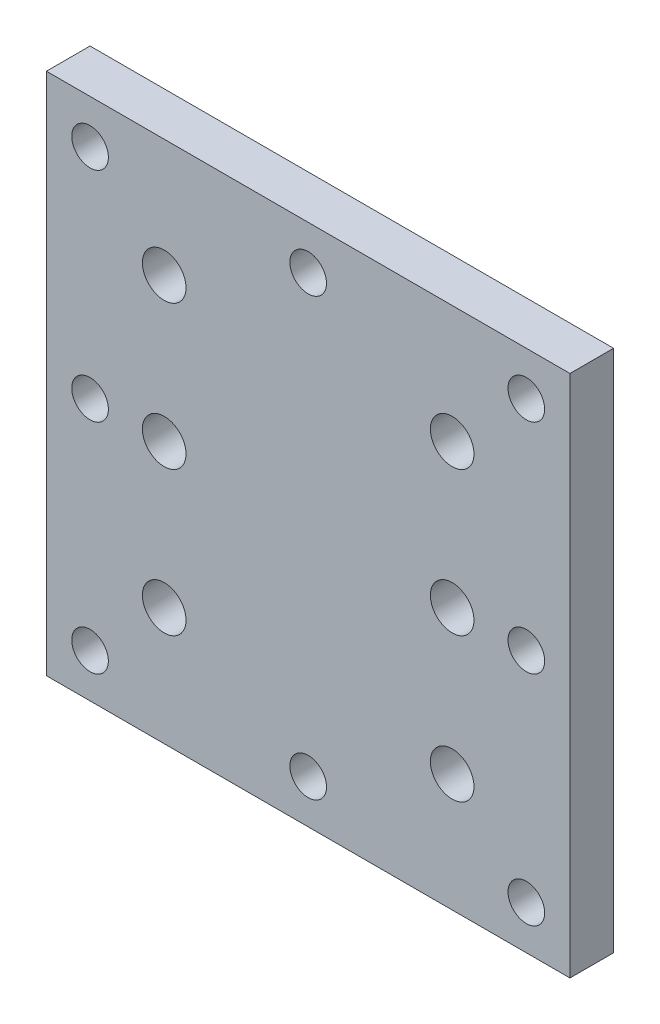
ISO-10303-21;
HEADER;
FILE_DESCRIPTION(('STEP AP214'),'2;1');
FILE_NAME('part.step','',(''),(''),'','','');
FILE_SCHEMA(('AUTOMOTIVE_DESIGN { 1 0 10303 214 1 1 1 1 }'));
ENDSEC;
DATA;
#1=APPLICATION_CONTEXT('core data for automotive mechanical design processes');
#2=APPLICATION_PROTOCOL_DEFINITION('international standard','automotive_design',2000,#1);
#3=PRODUCT_CONTEXT('',#1,'mechanical');
#4=PRODUCT('Part','Part','',(#3));
#5=PRODUCT_RELATED_PRODUCT_CATEGORY('part','',(#4));
#6=PRODUCT_DEFINITION_FORMATION('','',#4);
#7=PRODUCT_DEFINITION_CONTEXT('part definition',#1,'design');
#8=PRODUCT_DEFINITION('design','',#6,#7);
#9=PRODUCT_DEFINITION_SHAPE('','',#8);
#10=(LENGTH_UNIT() NAMED_UNIT(*) SI_UNIT(.MILLI.,.METRE.));
#11=(NAMED_UNIT(*) PLANE_ANGLE_UNIT() SI_UNIT($,.RADIAN.));
#12=(NAMED_UNIT(*) SI_UNIT($,.STERADIAN.) SOLID_ANGLE_UNIT());
#13=UNCERTAINTY_MEASURE_WITH_UNIT(LENGTH_MEASURE(1.E-05),#10,'distance_accuracy_value','');
#14=(GEOMETRIC_REPRESENTATION_CONTEXT(3) GLOBAL_UNCERTAINTY_ASSIGNED_CONTEXT((#13)) GLOBAL_UNIT_ASSIGNED_CONTEXT((#10,
#11,#12)) REPRESENTATION_CONTEXT('',''));
#15=CARTESIAN_POINT('',(0.,0.,0.));
#16=DIRECTION('',(0.,0.,1.));
#17=DIRECTION('',(1.,0.,0.));
#18=AXIS2_PLACEMENT_3D('',#15,#16,#17);
#19=CARTESIAN_POINT('',(16.5,0.,-5.));
#20=DIRECTION('',(0.,0.,1.));
#21=DIRECTION('',(1.,0.,0.));
#22=AXIS2_PLACEMENT_3D('',#19,#20,#21);
#23=CYLINDRICAL_SURFACE('',#22,2.5);
#24=CARTESIAN_POINT('',(16.5,0.,0.));
#25=DIRECTION('',(0.,0.,-1.));
#26=DIRECTION('',(-1.,0.,0.));
#27=AXIS2_PLACEMENT_3D('',#24,#25,#26);
#28=CIRCLE('',#27,2.5);
#29=CARTESIAN_POINT('',(14.,0.,0.));
#30=VERTEX_POINT('',#29);
#31=EDGE_CURVE('E180',#30,#30,#28,.T.);
#32=ORIENTED_EDGE('',*,*,#31,.T.);
#33=EDGE_LOOP('',(#32));
#34=FACE_BOUND('',#33,.T.);
#35=CARTESIAN_POINT('',(16.5,0.,5.));
#36=DIRECTION('',(0.,0.,1.));
#37=DIRECTION('',(-1.,0.,0.));
#38=AXIS2_PLACEMENT_3D('',#35,#36,#37);
#39=CIRCLE('',#38,2.5);
#40=CARTESIAN_POINT('',(14.,0.,5.));
#41=VERTEX_POINT('',#40);
#42=EDGE_CURVE('E104',#41,#41,#39,.T.);
#43=ORIENTED_EDGE('',*,*,#42,.T.);
#44=EDGE_LOOP('',(#43));
#45=FACE_BOUND('',#44,.T.);
#46=ADVANCED_FACE('F17',(#34,#45),#23,.F.);
#47=CARTESIAN_POINT('',(16.5,16.5,-5.));
#48=DIRECTION('',(0.,0.,1.));
#49=DIRECTION('',(1.,0.,0.));
#50=AXIS2_PLACEMENT_3D('',#47,#48,#49);
#51=CYLINDRICAL_SURFACE('',#50,2.5);
#52=CARTESIAN_POINT('',(16.5,16.5,0.));
#53=DIRECTION('',(0.,0.,-1.));
#54=DIRECTION('',(-1.,0.,0.));
#55=AXIS2_PLACEMENT_3D('',#52,#53,#54);
#56=CIRCLE('',#55,2.5);
#57=CARTESIAN_POINT('',(14.,16.5,0.));
#58=VERTEX_POINT('',#57);
#59=EDGE_CURVE('E184',#58,#58,#56,.T.);
#60=ORIENTED_EDGE('',*,*,#59,.T.);
#61=EDGE_LOOP('',(#60));
#62=FACE_BOUND('',#61,.T.);
#63=CARTESIAN_POINT('',(16.5,16.5,5.));
#64=DIRECTION('',(0.,0.,1.));
#65=DIRECTION('',(-1.,0.,0.));
#66=AXIS2_PLACEMENT_3D('',#63,#64,#65);
#67=CIRCLE('',#66,2.5);
#68=CARTESIAN_POINT('',(14.,16.5,5.));
#69=VERTEX_POINT('',#68);
#70=EDGE_CURVE('E131',#69,#69,#67,.T.);
#71=ORIENTED_EDGE('',*,*,#70,.T.);
#72=EDGE_LOOP('',(#71));
#73=FACE_BOUND('',#72,.T.);
#74=ADVANCED_FACE('F266',(#62,#73),#51,.F.);
#75=CARTESIAN_POINT('',(16.5,-16.5,-5.));
#76=DIRECTION('',(0.,0.,1.));
#77=DIRECTION('',(1.,0.,0.));
#78=AXIS2_PLACEMENT_3D('',#75,#76,#77);
#79=CYLINDRICAL_SURFACE('',#78,2.5);
#80=CARTESIAN_POINT('',(16.5,-16.5,0.));
#81=DIRECTION('',(0.,0.,-1.));
#82=DIRECTION('',(-1.,0.,0.));
#83=AXIS2_PLACEMENT_3D('',#80,#81,#82);
#84=CIRCLE('',#83,2.5);
#85=CARTESIAN_POINT('',(14.,-16.5,0.));
#86=VERTEX_POINT('',#85);
#87=EDGE_CURVE('E185',#86,#86,#84,.T.);
#88=ORIENTED_EDGE('',*,*,#87,.T.);
#89=EDGE_LOOP('',(#88));
#90=FACE_BOUND('',#89,.T.);
#91=CARTESIAN_POINT('',(16.5,-16.5,5.));
#92=DIRECTION('',(0.,0.,1.));
#93=DIRECTION('',(1.,0.,0.));
#94=AXIS2_PLACEMENT_3D('',#91,#92,#93);
#95=CIRCLE('',#94,2.5);
#96=CARTESIAN_POINT('',(19.,-16.5,5.));
#97=VERTEX_POINT('',#96);
#98=EDGE_CURVE('E126',#97,#97,#95,.T.);
#99=ORIENTED_EDGE('',*,*,#98,.T.);
#100=EDGE_LOOP('',(#99));
#101=FACE_BOUND('',#100,.T.);
#102=ADVANCED_FACE('F596',(#90,#101),#79,.F.);
#103=CARTESIAN_POINT('',(-16.5,-16.5,-5.));
#104=DIRECTION('',(0.,0.,1.));
#105=DIRECTION('',(1.,0.,0.));
#106=AXIS2_PLACEMENT_3D('',#103,#104,#105);
#107=CYLINDRICAL_SURFACE('',#106,2.5);
#108=CARTESIAN_POINT('',(-16.5,-16.5,0.));
#109=DIRECTION('',(0.,0.,-1.));
#110=DIRECTION('',(-1.,0.,0.));
#111=AXIS2_PLACEMENT_3D('',#108,#109,#110);
#112=CIRCLE('',#111,2.5);
#113=CARTESIAN_POINT('',(-19.,-16.5,0.));
#114=VERTEX_POINT('',#113);
#115=EDGE_CURVE('E189',#114,#114,#112,.T.);
#116=ORIENTED_EDGE('',*,*,#115,.T.);
#117=EDGE_LOOP('',(#116));
#118=FACE_BOUND('',#117,.T.);
#119=CARTESIAN_POINT('',(-16.5,-16.5,5.));
#120=DIRECTION('',(0.,0.,1.));
#121=DIRECTION('',(-1.,0.,0.));
#122=AXIS2_PLACEMENT_3D('',#119,#120,#121);
#123=CIRCLE('',#122,2.5);
#124=CARTESIAN_POINT('',(-19.,-16.5,5.));
#125=VERTEX_POINT('',#124);
#126=EDGE_CURVE('E130',#125,#125,#123,.T.);
#127=ORIENTED_EDGE('',*,*,#126,.T.);
#128=EDGE_LOOP('',(#127));
#129=FACE_BOUND('',#128,.T.);
#130=ADVANCED_FACE('F571',(#118,#129),#107,.F.);
#131=CARTESIAN_POINT('',(-16.5,0.,-5.));
#132=DIRECTION('',(0.,0.,1.));
#133=DIRECTION('',(1.,0.,0.));
#134=AXIS2_PLACEMENT_3D('',#131,#132,#133);
#135=CYLINDRICAL_SURFACE('',#134,2.5);
#136=CARTESIAN_POINT('',(-16.5,0.,0.));
#137=DIRECTION('',(0.,0.,-1.));
#138=DIRECTION('',(-1.,0.,0.));
#139=AXIS2_PLACEMENT_3D('',#136,#137,#138);
#140=CIRCLE('',#139,2.5);
#141=CARTESIAN_POINT('',(-19.,0.,0.));
#142=VERTEX_POINT('',#141);
#143=EDGE_CURVE('E193',#142,#142,#140,.T.);
#144=ORIENTED_EDGE('',*,*,#143,.T.);
#145=EDGE_LOOP('',(#144));
#146=FACE_BOUND('',#145,.T.);
#147=CARTESIAN_POINT('',(-16.5,0.,5.));
#148=DIRECTION('',(0.,0.,1.));
#149=DIRECTION('',(1.,0.,0.));
#150=AXIS2_PLACEMENT_3D('',#147,#148,#149);
#151=CIRCLE('',#150,2.5);
#152=CARTESIAN_POINT('',(-14.,0.,5.));
#153=VERTEX_POINT('',#152);
#154=EDGE_CURVE('E139',#153,#153,#151,.T.);
#155=ORIENTED_EDGE('',*,*,#154,.T.);
#156=EDGE_LOOP('',(#155));
#157=FACE_BOUND('',#156,.T.);
#158=ADVANCED_FACE('F566',(#146,#157),#135,.F.);
#159=CARTESIAN_POINT('',(-16.5,16.5,-5.));
#160=DIRECTION('',(0.,0.,1.));
#161=DIRECTION('',(1.,0.,0.));
#162=AXIS2_PLACEMENT_3D('',#159,#160,#161);
#163=CYLINDRICAL_SURFACE('',#162,2.5);
#164=CARTESIAN_POINT('',(-16.5,16.5,0.));
#165=DIRECTION('',(0.,0.,-1.));
#166=DIRECTION('',(-1.,0.,0.));
#167=AXIS2_PLACEMENT_3D('',#164,#165,#166);
#168=CIRCLE('',#167,2.5);
#169=CARTESIAN_POINT('',(-19.,16.5,0.));
#170=VERTEX_POINT('',#169);
#171=EDGE_CURVE('E197',#170,#170,#168,.T.);
#172=ORIENTED_EDGE('',*,*,#171,.T.);
#173=EDGE_LOOP('',(#172));
#174=FACE_BOUND('',#173,.T.);
#175=CARTESIAN_POINT('',(-16.5,16.5,5.));
#176=DIRECTION('',(0.,0.,1.));
#177=DIRECTION('',(1.,0.,0.));
#178=AXIS2_PLACEMENT_3D('',#175,#176,#177);
#179=CIRCLE('',#178,2.5);
#180=CARTESIAN_POINT('',(-14.,16.5,5.));
#181=VERTEX_POINT('',#180);
#182=EDGE_CURVE('E143',#181,#181,#179,.T.);
#183=ORIENTED_EDGE('',*,*,#182,.T.);
#184=EDGE_LOOP('',(#183));
#185=FACE_BOUND('',#184,.T.);
#186=ADVANCED_FACE('F570',(#174,#185),#163,.F.);
#187=CARTESIAN_POINT('',(-25.,25.,5.));
#188=DIRECTION('',(0.,0.,1.));
#189=DIRECTION('',(1.,0.,0.));
#190=AXIS2_PLACEMENT_3D('',#187,#188,#189);
#191=CYLINDRICAL_SURFACE('',#190,2.1);
#192=CARTESIAN_POINT('',(-25.,25.,0.));
#193=DIRECTION('',(0.,0.,-1.));
#194=DIRECTION('',(-1.,0.,0.));
#195=AXIS2_PLACEMENT_3D('',#192,#193,#194);
#196=CIRCLE('',#195,2.1);
#197=CARTESIAN_POINT('',(-27.1,25.,0.));
#198=VERTEX_POINT('',#197);
#199=EDGE_CURVE('E201',#198,#198,#196,.T.);
#200=ORIENTED_EDGE('',*,*,#199,.T.);
#201=EDGE_LOOP('',(#200));
#202=FACE_BOUND('',#201,.T.);
#203=CARTESIAN_POINT('',(-25.,25.,5.));
#204=DIRECTION('',(0.,0.,1.));
#205=DIRECTION('',(1.,0.,0.));
#206=AXIS2_PLACEMENT_3D('',#203,#204,#205);
#207=CIRCLE('',#206,2.1);
#208=CARTESIAN_POINT('',(-22.9,25.,5.));
#209=VERTEX_POINT('',#208);
#210=EDGE_CURVE('E154',#209,#209,#207,.T.);
#211=ORIENTED_EDGE('',*,*,#210,.T.);
#212=EDGE_LOOP('',(#211));
#213=FACE_BOUND('',#212,.T.);
#214=ADVANCED_FACE('F552',(#202,#213),#191,.F.);
#215=CARTESIAN_POINT('',(0.,25.,5.));
#216=DIRECTION('',(0.,0.,1.));
#217=DIRECTION('',(1.,0.,0.));
#218=AXIS2_PLACEMENT_3D('',#215,#216,#217);
#219=CYLINDRICAL_SURFACE('',#218,2.1);
#220=CARTESIAN_POINT('',(0.,25.,0.));
#221=DIRECTION('',(0.,0.,-1.));
#222=DIRECTION('',(-1.,0.,0.));
#223=AXIS2_PLACEMENT_3D('',#220,#221,#222);
#224=CIRCLE('',#223,2.1);
#225=CARTESIAN_POINT('',(-2.1,25.,0.));
#226=VERTEX_POINT('',#225);
#227=EDGE_CURVE('E202',#226,#226,#224,.T.);
#228=ORIENTED_EDGE('',*,*,#227,.T.);
#229=EDGE_LOOP('',(#228));
#230=FACE_BOUND('',#229,.T.);
#231=CARTESIAN_POINT('',(0.,25.,5.));
#232=DIRECTION('',(0.,0.,1.));
#233=DIRECTION('',(1.,0.,0.));
#234=AXIS2_PLACEMENT_3D('',#231,#232,#233);
#235=CIRCLE('',#234,2.1);
#236=CARTESIAN_POINT('',(2.1,25.,5.));
#237=VERTEX_POINT('',#236);
#238=EDGE_CURVE('E158',#237,#237,#235,.T.);
#239=ORIENTED_EDGE('',*,*,#238,.T.);
#240=EDGE_LOOP('',(#239));
#241=FACE_BOUND('',#240,.T.);
#242=ADVANCED_FACE('F513',(#230,#241),#219,.F.);
#243=CARTESIAN_POINT('',(25.,25.,5.));
#244=DIRECTION('',(0.,0.,1.));
#245=DIRECTION('',(1.,0.,0.));
#246=AXIS2_PLACEMENT_3D('',#243,#244,#245);
#247=CYLINDRICAL_SURFACE('',#246,2.1);
#248=CARTESIAN_POINT('',(25.,25.,0.));
#249=DIRECTION('',(0.,0.,-1.));
#250=DIRECTION('',(-1.,0.,0.));
#251=AXIS2_PLACEMENT_3D('',#248,#249,#250);
#252=CIRCLE('',#251,2.1);
#253=CARTESIAN_POINT('',(22.9,25.,0.));
#254=VERTEX_POINT('',#253);
#255=EDGE_CURVE('E206',#254,#254,#252,.T.);
#256=ORIENTED_EDGE('',*,*,#255,.T.);
#257=EDGE_LOOP('',(#256));
#258=FACE_BOUND('',#257,.T.);
#259=CARTESIAN_POINT('',(25.,25.,5.));
#260=DIRECTION('',(0.,0.,1.));
#261=DIRECTION('',(1.,0.,0.));
#262=AXIS2_PLACEMENT_3D('',#259,#260,#261);
#263=CIRCLE('',#262,2.1);
#264=CARTESIAN_POINT('',(27.1,25.,5.));
#265=VERTEX_POINT('',#264);
#266=EDGE_CURVE('E163',#265,#265,#263,.T.);
#267=ORIENTED_EDGE('',*,*,#266,.T.);
#268=EDGE_LOOP('',(#267));
#269=FACE_BOUND('',#268,.T.);
#270=ADVANCED_FACE('F508',(#258,#269),#247,.F.);
#271=CARTESIAN_POINT('',(25.,-25.,5.));
#272=DIRECTION('',(0.,0.,1.));
#273=DIRECTION('',(1.,0.,0.));
#274=AXIS2_PLACEMENT_3D('',#271,#272,#273);
#275=CYLINDRICAL_SURFACE('',#274,2.1);
#276=CARTESIAN_POINT('',(25.,-25.,0.));
#277=DIRECTION('',(0.,0.,-1.));
#278=DIRECTION('',(-1.,0.,0.));
#279=AXIS2_PLACEMENT_3D('',#276,#277,#278);
#280=CIRCLE('',#279,2.1);
#281=CARTESIAN_POINT('',(22.9,-25.,0.));
#282=VERTEX_POINT('',#281);
#283=EDGE_CURVE('E213',#282,#282,#280,.T.);
#284=ORIENTED_EDGE('',*,*,#283,.T.);
#285=EDGE_LOOP('',(#284));
#286=FACE_BOUND('',#285,.T.);
#287=CARTESIAN_POINT('',(25.,-25.,5.));
#288=DIRECTION('',(0.,0.,1.));
#289=DIRECTION('',(1.,0.,0.));
#290=AXIS2_PLACEMENT_3D('',#287,#288,#289);
#291=CIRCLE('',#290,2.1);
#292=CARTESIAN_POINT('',(27.1,-25.,5.));
#293=VERTEX_POINT('',#292);
#294=EDGE_CURVE('E159',#293,#293,#291,.T.);
#295=ORIENTED_EDGE('',*,*,#294,.T.);
#296=EDGE_LOOP('',(#295));
#297=FACE_BOUND('',#296,.T.);
#298=ADVANCED_FACE('F512',(#286,#297),#275,.F.);
#299=CARTESIAN_POINT('',(0.,-25.,5.));
#300=DIRECTION('',(0.,0.,1.));
#301=DIRECTION('',(1.,0.,0.));
#302=AXIS2_PLACEMENT_3D('',#299,#300,#301);
#303=CYLINDRICAL_SURFACE('',#302,2.1);
#304=CARTESIAN_POINT('',(0.,-25.,0.));
#305=DIRECTION('',(0.,0.,-1.));
#306=DIRECTION('',(-1.,0.,0.));
#307=AXIS2_PLACEMENT_3D('',#304,#305,#306);
#308=CIRCLE('',#307,2.1);
#309=CARTESIAN_POINT('',(-2.09999999999999,-25.,0.));
#310=VERTEX_POINT('',#309);
#311=EDGE_CURVE('E217',#310,#310,#308,.T.);
#312=ORIENTED_EDGE('',*,*,#311,.T.);
#313=EDGE_LOOP('',(#312));
#314=FACE_BOUND('',#313,.T.);
#315=CARTESIAN_POINT('',(0.,-25.,5.));
#316=DIRECTION('',(0.,0.,1.));
#317=DIRECTION('',(1.,0.,0.));
#318=AXIS2_PLACEMENT_3D('',#315,#316,#317);
#319=CIRCLE('',#318,2.1);
#320=CARTESIAN_POINT('',(2.10000000000001,-25.,5.));
#321=VERTEX_POINT('',#320);
#322=EDGE_CURVE('E120',#321,#321,#319,.T.);
#323=ORIENTED_EDGE('',*,*,#322,.T.);
#324=EDGE_LOOP('',(#323));
#325=FACE_BOUND('',#324,.T.);
#326=ADVANCED_FACE('F535',(#314,#325),#303,.F.);
#327=CARTESIAN_POINT('',(-25.,-25.,5.));
#328=DIRECTION('',(0.,0.,1.));
#329=DIRECTION('',(1.,0.,0.));
#330=AXIS2_PLACEMENT_3D('',#327,#328,#329);
#331=CYLINDRICAL_SURFACE('',#330,2.1);
#332=CARTESIAN_POINT('',(-25.,-25.,0.));
#333=DIRECTION('',(0.,0.,-1.));
#334=DIRECTION('',(-1.,0.,0.));
#335=AXIS2_PLACEMENT_3D('',#332,#333,#334);
#336=CIRCLE('',#335,2.1);
#337=CARTESIAN_POINT('',(-27.1,-25.,0.));
#338=VERTEX_POINT('',#337);
#339=EDGE_CURVE('E221',#338,#338,#336,.T.);
#340=ORIENTED_EDGE('',*,*,#339,.T.);
#341=EDGE_LOOP('',(#340));
#342=FACE_BOUND('',#341,.T.);
#343=CARTESIAN_POINT('',(-25.,-25.,5.));
#344=DIRECTION('',(0.,0.,1.));
#345=DIRECTION('',(1.,0.,0.));
#346=AXIS2_PLACEMENT_3D('',#343,#344,#345);
#347=CIRCLE('',#346,2.1);
#348=CARTESIAN_POINT('',(-22.9,-25.,5.));
#349=VERTEX_POINT('',#348);
#350=EDGE_CURVE('E115',#349,#349,#347,.T.);
#351=ORIENTED_EDGE('',*,*,#350,.T.);
#352=EDGE_LOOP('',(#351));
#353=FACE_BOUND('',#352,.T.);
#354=ADVANCED_FACE('F488',(#342,#353),#331,.F.);
#355=CARTESIAN_POINT('',(-25.,0.,5.));
#356=DIRECTION('',(0.,0.,1.));
#357=DIRECTION('',(1.,0.,0.));
#358=AXIS2_PLACEMENT_3D('',#355,#356,#357);
#359=CYLINDRICAL_SURFACE('',#358,2.1);
#360=CARTESIAN_POINT('',(-25.,0.,0.));
#361=DIRECTION('',(0.,0.,-1.));
#362=DIRECTION('',(-1.,0.,0.));
#363=AXIS2_PLACEMENT_3D('',#360,#361,#362);
#364=CIRCLE('',#363,2.1);
#365=CARTESIAN_POINT('',(-27.1,0.,0.));
#366=VERTEX_POINT('',#365);
#367=EDGE_CURVE('E25',#366,#366,#364,.T.);
#368=ORIENTED_EDGE('',*,*,#367,.T.);
#369=EDGE_LOOP('',(#368));
#370=FACE_BOUND('',#369,.T.);
#371=CARTESIAN_POINT('',(-25.,0.,5.));
#372=DIRECTION('',(0.,0.,1.));
#373=DIRECTION('',(1.,0.,0.));
#374=AXIS2_PLACEMENT_3D('',#371,#372,#373);
#375=CIRCLE('',#374,2.1);
#376=CARTESIAN_POINT('',(-22.9,0.,5.));
#377=VERTEX_POINT('',#376);
#378=EDGE_CURVE('E119',#377,#377,#375,.T.);
#379=ORIENTED_EDGE('',*,*,#378,.T.);
#380=EDGE_LOOP('',(#379));
#381=FACE_BOUND('',#380,.T.);
#382=ADVANCED_FACE('F230',(#370,#381),#359,.F.);
#383=CARTESIAN_POINT('',(25.,0.,5.));
#384=DIRECTION('',(0.,0.,1.));
#385=DIRECTION('',(1.,0.,0.));
#386=AXIS2_PLACEMENT_3D('',#383,#384,#385);
#387=CYLINDRICAL_SURFACE('',#386,2.1);
#388=CARTESIAN_POINT('',(25.,0.,0.));
#389=DIRECTION('',(0.,0.,-1.));
#390=DIRECTION('',(-1.,0.,0.));
#391=AXIS2_PLACEMENT_3D('',#388,#389,#390);
#392=CIRCLE('',#391,2.1);
#393=CARTESIAN_POINT('',(22.9,0.,0.));
#394=VERTEX_POINT('',#393);
#395=EDGE_CURVE('E11',#394,#394,#392,.T.);
#396=ORIENTED_EDGE('',*,*,#395,.T.);
#397=EDGE_LOOP('',(#396));
#398=FACE_BOUND('',#397,.T.);
#399=CARTESIAN_POINT('',(25.,0.,5.));
#400=DIRECTION('',(0.,0.,1.));
#401=DIRECTION('',(1.,0.,0.));
#402=AXIS2_PLACEMENT_3D('',#399,#400,#401);
#403=CIRCLE('',#402,2.1);
#404=CARTESIAN_POINT('',(27.1,0.,5.));
#405=VERTEX_POINT('',#404);
#406=EDGE_CURVE('E176',#405,#405,#403,.T.);
#407=ORIENTED_EDGE('',*,*,#406,.T.);
#408=EDGE_LOOP('',(#407));
#409=FACE_BOUND('',#408,.T.);
#410=ADVANCED_FACE('F236',(#398,#409),#387,.F.);
#411=CARTESIAN_POINT('',(0.,0.,0.));
#412=DIRECTION('',(0.,0.,-1.));
#413=DIRECTION('',(0.,-1.,0.));
#414=AXIS2_PLACEMENT_3D('',#411,#412,#413);
#415=PLANE('',#414);
#416=ORIENTED_EDGE('',*,*,#395,.F.);
#417=EDGE_LOOP('',(#416));
#418=FACE_BOUND('',#417,.T.);
#419=ORIENTED_EDGE('',*,*,#367,.F.);
#420=EDGE_LOOP('',(#419));
#421=FACE_BOUND('',#420,.T.);
#422=ORIENTED_EDGE('',*,*,#339,.F.);
#423=EDGE_LOOP('',(#422));
#424=FACE_BOUND('',#423,.T.);
#425=ORIENTED_EDGE('',*,*,#311,.F.);
#426=EDGE_LOOP('',(#425));
#427=FACE_BOUND('',#426,.T.);
#428=ORIENTED_EDGE('',*,*,#283,.F.);
#429=EDGE_LOOP('',(#428));
#430=FACE_BOUND('',#429,.T.);
#431=ORIENTED_EDGE('',*,*,#255,.F.);
#432=EDGE_LOOP('',(#431));
#433=FACE_BOUND('',#432,.T.);
#434=ORIENTED_EDGE('',*,*,#227,.F.);
#435=EDGE_LOOP('',(#434));
#436=FACE_BOUND('',#435,.T.);
#437=ORIENTED_EDGE('',*,*,#199,.F.);
#438=EDGE_LOOP('',(#437));
#439=FACE_BOUND('',#438,.T.);
#440=ORIENTED_EDGE('',*,*,#171,.F.);
#441=EDGE_LOOP('',(#440));
#442=FACE_BOUND('',#441,.T.);
#443=ORIENTED_EDGE('',*,*,#143,.F.);
#444=EDGE_LOOP('',(#443));
#445=FACE_BOUND('',#444,.T.);
#446=ORIENTED_EDGE('',*,*,#115,.F.);
#447=EDGE_LOOP('',(#446));
#448=FACE_BOUND('',#447,.T.);
#449=ORIENTED_EDGE('',*,*,#87,.F.);
#450=EDGE_LOOP('',(#449));
#451=FACE_BOUND('',#450,.T.);
#452=ORIENTED_EDGE('',*,*,#59,.F.);
#453=EDGE_LOOP('',(#452));
#454=FACE_BOUND('',#453,.T.);
#455=ORIENTED_EDGE('',*,*,#31,.F.);
#456=EDGE_LOOP('',(#455));
#457=FACE_BOUND('',#456,.T.);
#458=DIRECTION('',(0.,1.,0.));
#459=VECTOR('',#458,1.);
#460=CARTESIAN_POINT('',(30.,-30.,0.));
#461=LINE('',#460,#459);
#462=CARTESIAN_POINT('',(30.,-30.,0.));
#463=VERTEX_POINT('',#462);
#464=CARTESIAN_POINT('',(30.,30.,0.));
#465=VERTEX_POINT('',#464);
#466=EDGE_CURVE('E86',#463,#465,#461,.T.);
#467=ORIENTED_EDGE('',*,*,#466,.F.);
#468=DIRECTION('',(1.,0.,0.));
#469=VECTOR('',#468,1.);
#470=CARTESIAN_POINT('',(-30.,-30.,0.));
#471=LINE('',#470,#469);
#472=CARTESIAN_POINT('',(-30.,-30.,0.));
#473=VERTEX_POINT('',#472);
#474=EDGE_CURVE('E49',#473,#463,#471,.T.);
#475=ORIENTED_EDGE('',*,*,#474,.F.);
#476=DIRECTION('',(0.,-1.,0.));
#477=VECTOR('',#476,1.);
#478=CARTESIAN_POINT('',(-30.,-30.,0.));
#479=LINE('',#478,#477);
#480=CARTESIAN_POINT('',(-30.,30.,0.));
#481=VERTEX_POINT('',#480);
#482=EDGE_CURVE('E113',#481,#473,#479,.T.);
#483=ORIENTED_EDGE('',*,*,#482,.F.);
#484=DIRECTION('',(-1.,0.,0.));
#485=VECTOR('',#484,1.);
#486=CARTESIAN_POINT('',(-30.,30.,0.));
#487=LINE('',#486,#485);
#488=EDGE_CURVE('E90',#465,#481,#487,.T.);
#489=ORIENTED_EDGE('',*,*,#488,.F.);
#490=EDGE_LOOP('',(#467,#475,#483,#489));
#491=FACE_BOUND('',#490,.T.);
#492=ADVANCED_FACE('F92',(#418,#421,#424,#427,#430,#433,#436,#439,#442,#445,#448,#451,#454,#457,
#491),#415,.T.);
#493=CARTESIAN_POINT('',(0.,0.,5.));
#494=DIRECTION('',(0.,0.,-1.));
#495=DIRECTION('',(0.,-1.,0.));
#496=AXIS2_PLACEMENT_3D('',#493,#494,#495);
#497=PLANE('',#496);
#498=ORIENTED_EDGE('',*,*,#406,.F.);
#499=EDGE_LOOP('',(#498));
#500=FACE_BOUND('',#499,.T.);
#501=ORIENTED_EDGE('',*,*,#378,.F.);
#502=EDGE_LOOP('',(#501));
#503=FACE_BOUND('',#502,.T.);
#504=ORIENTED_EDGE('',*,*,#350,.F.);
#505=EDGE_LOOP('',(#504));
#506=FACE_BOUND('',#505,.T.);
#507=ORIENTED_EDGE('',*,*,#322,.F.);
#508=EDGE_LOOP('',(#507));
#509=FACE_BOUND('',#508,.T.);
#510=ORIENTED_EDGE('',*,*,#294,.F.);
#511=EDGE_LOOP('',(#510));
#512=FACE_BOUND('',#511,.T.);
#513=ORIENTED_EDGE('',*,*,#266,.F.);
#514=EDGE_LOOP('',(#513));
#515=FACE_BOUND('',#514,.T.);
#516=ORIENTED_EDGE('',*,*,#238,.F.);
#517=EDGE_LOOP('',(#516));
#518=FACE_BOUND('',#517,.T.);
#519=ORIENTED_EDGE('',*,*,#210,.F.);
#520=EDGE_LOOP('',(#519));
#521=FACE_BOUND('',#520,.T.);
#522=ORIENTED_EDGE('',*,*,#182,.F.);
#523=EDGE_LOOP('',(#522));
#524=FACE_BOUND('',#523,.T.);
#525=ORIENTED_EDGE('',*,*,#154,.F.);
#526=EDGE_LOOP('',(#525));
#527=FACE_BOUND('',#526,.T.);
#528=ORIENTED_EDGE('',*,*,#126,.F.);
#529=EDGE_LOOP('',(#528));
#530=FACE_BOUND('',#529,.T.);
#531=ORIENTED_EDGE('',*,*,#98,.F.);
#532=EDGE_LOOP('',(#531));
#533=FACE_BOUND('',#532,.T.);
#534=ORIENTED_EDGE('',*,*,#70,.F.);
#535=EDGE_LOOP('',(#534));
#536=FACE_BOUND('',#535,.T.);
#537=ORIENTED_EDGE('',*,*,#42,.F.);
#538=EDGE_LOOP('',(#537));
#539=FACE_BOUND('',#538,.T.);
#540=DIRECTION('',(0.,1.,0.));
#541=VECTOR('',#540,1.);
#542=CARTESIAN_POINT('',(30.,-30.,5.));
#543=LINE('',#542,#541);
#544=CARTESIAN_POINT('',(30.,-30.,5.));
#545=VERTEX_POINT('',#544);
#546=CARTESIAN_POINT('',(30.,30.,5.));
#547=VERTEX_POINT('',#546);
#548=EDGE_CURVE('E88',#545,#547,#543,.T.);
#549=ORIENTED_EDGE('',*,*,#548,.T.);
#550=DIRECTION('',(-1.,0.,0.));
#551=VECTOR('',#550,1.);
#552=CARTESIAN_POINT('',(-30.,30.,5.));
#553=LINE('',#552,#551);
#554=CARTESIAN_POINT('',(-30.,30.,5.));
#555=VERTEX_POINT('',#554);
#556=EDGE_CURVE('E109',#547,#555,#553,.T.);
#557=ORIENTED_EDGE('',*,*,#556,.T.);
#558=DIRECTION('',(0.,-1.,0.));
#559=VECTOR('',#558,1.);
#560=CARTESIAN_POINT('',(-30.,-30.,5.));
#561=LINE('',#560,#559);
#562=CARTESIAN_POINT('',(-30.,-30.,5.));
#563=VERTEX_POINT('',#562);
#564=EDGE_CURVE('E80',#555,#563,#561,.T.);
#565=ORIENTED_EDGE('',*,*,#564,.T.);
#566=DIRECTION('',(1.,0.,0.));
#567=VECTOR('',#566,1.);
#568=CARTESIAN_POINT('',(-30.,-30.,5.));
#569=LINE('',#568,#567);
#570=EDGE_CURVE('E38',#563,#545,#569,.T.);
#571=ORIENTED_EDGE('',*,*,#570,.T.);
#572=EDGE_LOOP('',(#549,#557,#565,#571));
#573=FACE_BOUND('',#572,.T.);
#574=ADVANCED_FACE('F235',(#500,#503,#506,#509,#512,#515,#518,#521,#524,#527,#530,#533,#536,
#539,#573),#497,.F.);
#575=CARTESIAN_POINT('',(-30.,-30.,5.));
#576=DIRECTION('',(0.,1.,0.));
#577=DIRECTION('',(1.,0.,0.));
#578=AXIS2_PLACEMENT_3D('',#575,#576,#577);
#579=PLANE('',#578);
#580=ORIENTED_EDGE('',*,*,#474,.T.);
#581=DIRECTION('',(0.,0.,-1.));
#582=VECTOR('',#581,1.);
#583=CARTESIAN_POINT('',(30.,-30.,5.));
#584=LINE('',#583,#582);
#585=EDGE_CURVE('E74',#545,#463,#584,.T.);
#586=ORIENTED_EDGE('',*,*,#585,.F.);
#587=ORIENTED_EDGE('',*,*,#570,.F.);
#588=DIRECTION('',(0.,0.,-1.));
#589=VECTOR('',#588,1.);
#590=CARTESIAN_POINT('',(-30.,-30.,5.));
#591=LINE('',#590,#589);
#592=EDGE_CURVE('E77',#563,#473,#591,.T.);
#593=ORIENTED_EDGE('',*,*,#592,.T.);
#594=EDGE_LOOP('',(#580,#586,#587,#593));
#595=FACE_BOUND('',#594,.T.);
#596=ADVANCED_FACE('F73',(#595),#579,.F.);
#597=CARTESIAN_POINT('',(-30.,-30.,5.));
#598=DIRECTION('',(1.,0.,0.));
#599=DIRECTION('',(0.,1.,0.));
#600=AXIS2_PLACEMENT_3D('',#597,#598,#599);
#601=PLANE('',#600);
#602=ORIENTED_EDGE('',*,*,#482,.T.);
#603=ORIENTED_EDGE('',*,*,#592,.F.);
#604=ORIENTED_EDGE('',*,*,#564,.F.);
#605=DIRECTION('',(0.,0.,-1.));
#606=VECTOR('',#605,1.);
#607=CARTESIAN_POINT('',(-30.,30.,5.));
#608=LINE('',#607,#606);
#609=EDGE_CURVE('E114',#555,#481,#608,.T.);
#610=ORIENTED_EDGE('',*,*,#609,.T.);
#611=EDGE_LOOP('',(#602,#603,#604,#610));
#612=FACE_BOUND('',#611,.T.);
#613=ADVANCED_FACE('F471',(#612),#601,.F.);
#614=CARTESIAN_POINT('',(-30.,30.,5.));
#615=DIRECTION('',(0.,-1.,0.));
#616=DIRECTION('',(0.,0.,-1.));
#617=AXIS2_PLACEMENT_3D('',#614,#615,#616);
#618=PLANE('',#617);
#619=ORIENTED_EDGE('',*,*,#488,.T.);
#620=ORIENTED_EDGE('',*,*,#609,.F.);
#621=ORIENTED_EDGE('',*,*,#556,.F.);
#622=DIRECTION('',(0.,0.,-1.));
#623=VECTOR('',#622,1.);
#624=CARTESIAN_POINT('',(30.,30.,5.));
#625=LINE('',#624,#623);
#626=EDGE_CURVE('E96',#547,#465,#625,.T.);
#627=ORIENTED_EDGE('',*,*,#626,.T.);
#628=EDGE_LOOP('',(#619,#620,#621,#627));
#629=FACE_BOUND('',#628,.T.);
#630=ADVANCED_FACE('F463',(#629),#618,.F.);
#631=CARTESIAN_POINT('',(30.,-30.,5.));
#632=DIRECTION('',(-1.,0.,0.));
#633=DIRECTION('',(0.,0.,1.));
#634=AXIS2_PLACEMENT_3D('',#631,#632,#633);
#635=PLANE('',#634);
#636=ORIENTED_EDGE('',*,*,#466,.T.);
#637=ORIENTED_EDGE('',*,*,#626,.F.);
#638=ORIENTED_EDGE('',*,*,#548,.F.);
#639=ORIENTED_EDGE('',*,*,#585,.T.);
#640=EDGE_LOOP('',(#636,#637,#638,#639));
#641=FACE_BOUND('',#640,.T.);
#642=ADVANCED_FACE('F84',(#641),#635,.F.);
#643=CLOSED_SHELL('',(#46,#74,#102,#130,#158,#186,#214,#242,#270,#298,#326,#354,#382,#410,#492,
#574,#596,#613,#630,#642));
#644=MANIFOLD_SOLID_BREP('B1',#643);
#645=ADVANCED_BREP_SHAPE_REPRESENTATION('',(#18,#644),#14);
#646=SHAPE_DEFINITION_REPRESENTATION(#9,#645);
ENDSEC;
END-ISO-10303-21;
